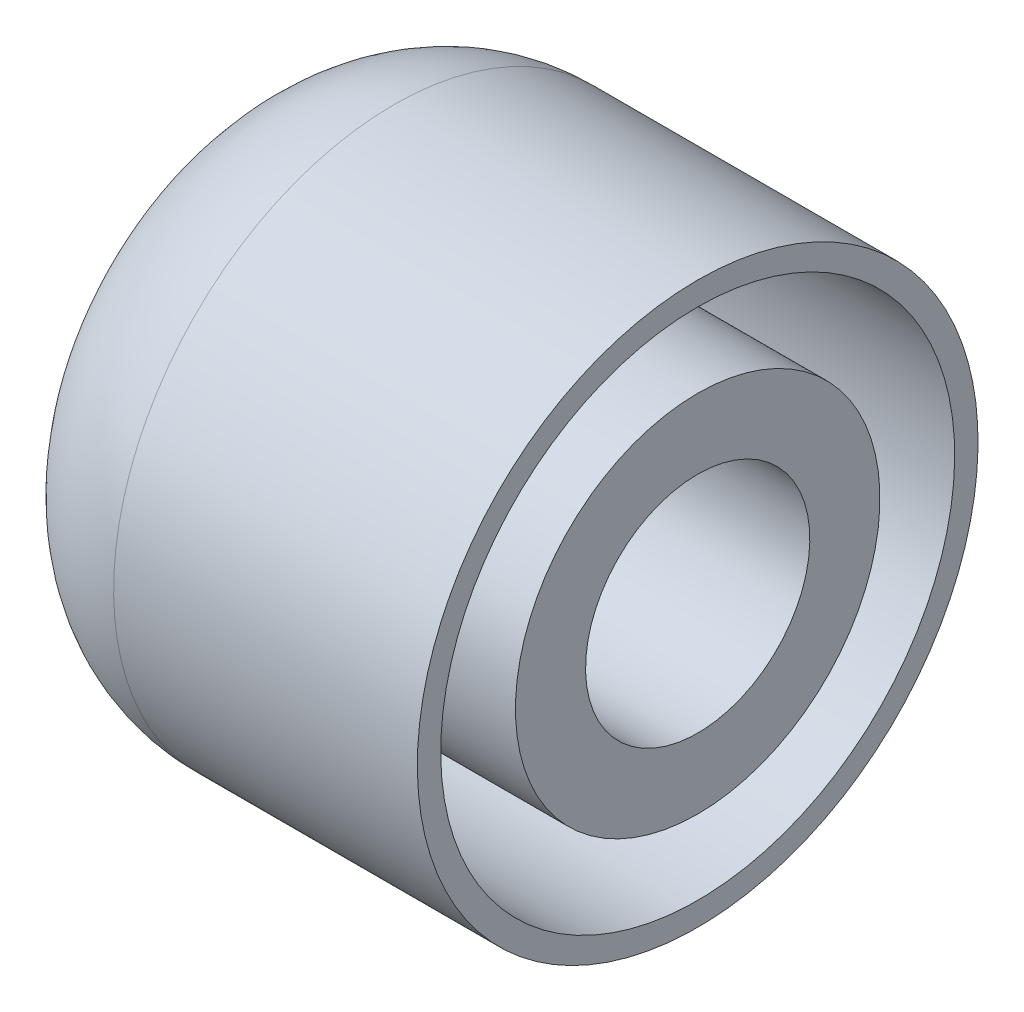
ISO-10303-21;
HEADER;
FILE_DESCRIPTION(('STEP AP214'),'2;1');
FILE_NAME('part.step','',(''),(''),'','','');
FILE_SCHEMA(('AUTOMOTIVE_DESIGN { 1 0 10303 214 1 1 1 1 }'));
ENDSEC;
DATA;
#1=APPLICATION_CONTEXT('core data for automotive mechanical design processes');
#2=APPLICATION_PROTOCOL_DEFINITION('international standard','automotive_design',2000,#1);
#3=PRODUCT_CONTEXT('',#1,'mechanical');
#4=PRODUCT('Part','Part','',(#3));
#5=PRODUCT_RELATED_PRODUCT_CATEGORY('part','',(#4));
#6=PRODUCT_DEFINITION_FORMATION('','',#4);
#7=PRODUCT_DEFINITION_CONTEXT('part definition',#1,'design');
#8=PRODUCT_DEFINITION('design','',#6,#7);
#9=PRODUCT_DEFINITION_SHAPE('','',#8);
#10=(LENGTH_UNIT() NAMED_UNIT(*) SI_UNIT(.MILLI.,.METRE.));
#11=(NAMED_UNIT(*) PLANE_ANGLE_UNIT() SI_UNIT($,.RADIAN.));
#12=(NAMED_UNIT(*) SI_UNIT($,.STERADIAN.) SOLID_ANGLE_UNIT());
#13=UNCERTAINTY_MEASURE_WITH_UNIT(LENGTH_MEASURE(1.E-05),#10,'distance_accuracy_value','');
#14=(GEOMETRIC_REPRESENTATION_CONTEXT(3) GLOBAL_UNCERTAINTY_ASSIGNED_CONTEXT((#13)) GLOBAL_UNIT_ASSIGNED_CONTEXT((#10,
#11,#12)) REPRESENTATION_CONTEXT('',''));
#15=CARTESIAN_POINT('',(0.,0.,0.));
#16=DIRECTION('',(0.,0.,1.));
#17=DIRECTION('',(1.,0.,0.));
#18=AXIS2_PLACEMENT_3D('',#15,#16,#17);
#19=CARTESIAN_POINT('',(0.,3.9,0.));
#20=DIRECTION('',(1.,0.,0.));
#21=DIRECTION('',(0.,1.,0.));
#22=AXIS2_PLACEMENT_3D('',#19,#20,#21);
#23=PLANE('',#22);
#24=CARTESIAN_POINT('',(0.,0.,0.));
#25=DIRECTION('',(1.,0.,0.));
#26=DIRECTION('',(0.,1.,0.));
#27=AXIS2_PLACEMENT_3D('',#24,#25,#26);
#28=CIRCLE('',#27,3.9);
#29=CARTESIAN_POINT('',(0.,3.9,0.));
#30=VERTEX_POINT('',#29);
#31=EDGE_CURVE('E61',#30,#30,#28,.T.);
#32=ORIENTED_EDGE('',*,*,#31,.T.);
#33=EDGE_LOOP('',(#32));
#34=FACE_BOUND('',#33,.T.);
#35=CARTESIAN_POINT('',(0.,0.,0.));
#36=DIRECTION('',(1.,0.,0.));
#37=DIRECTION('',(0.,1.,0.));
#38=AXIS2_PLACEMENT_3D('',#35,#36,#37);
#39=CIRCLE('',#38,2.4);
#40=CARTESIAN_POINT('',(0.,2.4,0.));
#41=VERTEX_POINT('',#40);
#42=EDGE_CURVE('E10',#41,#41,#39,.T.);
#43=ORIENTED_EDGE('',*,*,#42,.F.);
#44=EDGE_LOOP('',(#43));
#45=FACE_BOUND('',#44,.T.);
#46=ADVANCED_FACE('F30',(#34,#45),#23,.T.);
#47=CARTESIAN_POINT('',(0.,0.,0.));
#48=DIRECTION('',(1.,0.,0.));
#49=DIRECTION('',(0.,1.,0.));
#50=AXIS2_PLACEMENT_3D('',#47,#48,#49);
#51=CYLINDRICAL_SURFACE('',#50,2.4);
#52=ORIENTED_EDGE('',*,*,#42,.T.);
#53=EDGE_LOOP('',(#52));
#54=FACE_BOUND('',#53,.T.);
#55=CARTESIAN_POINT('',(-10.,0.,0.));
#56=DIRECTION('',(1.,0.,0.));
#57=DIRECTION('',(0.,1.,0.));
#58=AXIS2_PLACEMENT_3D('',#55,#56,#57);
#59=CIRCLE('',#58,2.4);
#60=CARTESIAN_POINT('',(-10.,2.4,0.));
#61=VERTEX_POINT('',#60);
#62=EDGE_CURVE('E36',#61,#61,#59,.T.);
#63=ORIENTED_EDGE('',*,*,#62,.F.);
#64=EDGE_LOOP('',(#63));
#65=FACE_BOUND('',#64,.T.);
#66=ADVANCED_FACE('F79',(#54,#65),#51,.F.);
#67=CARTESIAN_POINT('',(-10.,2.4,0.));
#68=DIRECTION('',(-1.,0.,0.));
#69=DIRECTION('',(0.,-1.,0.));
#70=AXIS2_PLACEMENT_3D('',#67,#68,#69);
#71=PLANE('',#70);
#72=ORIENTED_EDGE('',*,*,#62,.T.);
#73=EDGE_LOOP('',(#72));
#74=FACE_BOUND('',#73,.T.);
#75=CARTESIAN_POINT('',(-10.,0.,0.));
#76=DIRECTION('',(1.,0.,0.));
#77=DIRECTION('',(0.,1.,0.));
#78=AXIS2_PLACEMENT_3D('',#75,#76,#77);
#79=CIRCLE('',#78,2.5);
#80=CARTESIAN_POINT('',(-10.,2.5,0.));
#81=VERTEX_POINT('',#80);
#82=EDGE_CURVE('E40',#81,#81,#79,.T.);
#83=ORIENTED_EDGE('',*,*,#82,.F.);
#84=EDGE_LOOP('',(#83));
#85=FACE_BOUND('',#84,.T.);
#86=ADVANCED_FACE('F83',(#74,#85),#71,.T.);
#87=CARTESIAN_POINT('',(-6.5,0.,0.));
#88=DIRECTION('',(1.,0.,0.));
#89=DIRECTION('',(0.,1.,0.));
#90=AXIS2_PLACEMENT_3D('',#87,#88,#89);
#91=DEGENERATE_TOROIDAL_SURFACE('',#90,2.5,3.5,.T.);
#92=ORIENTED_EDGE('',*,*,#82,.T.);
#93=EDGE_LOOP('',(#92));
#94=FACE_BOUND('',#93,.T.);
#95=CARTESIAN_POINT('',(-6.5,0.,0.));
#96=DIRECTION('',(1.,0.,0.));
#97=DIRECTION('',(0.,1.,0.));
#98=AXIS2_PLACEMENT_3D('',#95,#96,#97);
#99=CIRCLE('',#98,6.);
#100=CARTESIAN_POINT('',(-6.5,6.,0.));
#101=VERTEX_POINT('',#100);
#102=EDGE_CURVE('E44',#101,#101,#99,.T.);
#103=ORIENTED_EDGE('',*,*,#102,.F.);
#104=EDGE_LOOP('',(#103));
#105=FACE_BOUND('',#104,.T.);
#106=ADVANCED_FACE('F87',(#94,#105),#91,.T.);
#107=CARTESIAN_POINT('',(0.,0.,0.));
#108=DIRECTION('',(1.,0.,0.));
#109=DIRECTION('',(0.,1.,0.));
#110=AXIS2_PLACEMENT_3D('',#107,#108,#109);
#111=CYLINDRICAL_SURFACE('',#110,6.);
#112=ORIENTED_EDGE('',*,*,#102,.T.);
#113=EDGE_LOOP('',(#112));
#114=FACE_BOUND('',#113,.T.);
#115=CARTESIAN_POINT('',(0.,0.,0.));
#116=DIRECTION('',(1.,0.,0.));
#117=DIRECTION('',(0.,1.,0.));
#118=AXIS2_PLACEMENT_3D('',#115,#116,#117);
#119=CIRCLE('',#118,6.);
#120=CARTESIAN_POINT('',(0.,6.,0.));
#121=VERTEX_POINT('',#120);
#122=EDGE_CURVE('E49',#121,#121,#119,.T.);
#123=ORIENTED_EDGE('',*,*,#122,.F.);
#124=EDGE_LOOP('',(#123));
#125=FACE_BOUND('',#124,.T.);
#126=ADVANCED_FACE('F93',(#114,#125),#111,.T.);
#127=CARTESIAN_POINT('',(0.,6.,0.));
#128=DIRECTION('',(1.,0.,0.));
#129=DIRECTION('',(0.,1.,0.));
#130=AXIS2_PLACEMENT_3D('',#127,#128,#129);
#131=PLANE('',#130);
#132=ORIENTED_EDGE('',*,*,#122,.T.);
#133=EDGE_LOOP('',(#132));
#134=FACE_BOUND('',#133,.T.);
#135=CARTESIAN_POINT('',(0.,0.,0.));
#136=DIRECTION('',(1.,0.,0.));
#137=DIRECTION('',(0.,1.,0.));
#138=AXIS2_PLACEMENT_3D('',#135,#136,#137);
#139=CIRCLE('',#138,5.5);
#140=CARTESIAN_POINT('',(0.,5.5,0.));
#141=VERTEX_POINT('',#140);
#142=EDGE_CURVE('E52',#141,#141,#139,.T.);
#143=ORIENTED_EDGE('',*,*,#142,.F.);
#144=EDGE_LOOP('',(#143));
#145=FACE_BOUND('',#144,.T.);
#146=ADVANCED_FACE('F97',(#134,#145),#131,.T.);
#147=CARTESIAN_POINT('',(0.,0.,0.));
#148=DIRECTION('',(1.,0.,0.));
#149=DIRECTION('',(0.,1.,0.));
#150=AXIS2_PLACEMENT_3D('',#147,#148,#149);
#151=CYLINDRICAL_SURFACE('',#150,5.5);
#152=ORIENTED_EDGE('',*,*,#142,.T.);
#153=EDGE_LOOP('',(#152));
#154=FACE_BOUND('',#153,.T.);
#155=CARTESIAN_POINT('',(-6.,0.,0.));
#156=DIRECTION('',(1.,0.,0.));
#157=DIRECTION('',(0.,1.,0.));
#158=AXIS2_PLACEMENT_3D('',#155,#156,#157);
#159=CIRCLE('',#158,5.5);
#160=CARTESIAN_POINT('',(-6.,5.5,0.));
#161=VERTEX_POINT('',#160);
#162=EDGE_CURVE('E55',#161,#161,#159,.T.);
#163=ORIENTED_EDGE('',*,*,#162,.F.);
#164=EDGE_LOOP('',(#163));
#165=FACE_BOUND('',#164,.T.);
#166=ADVANCED_FACE('F75',(#154,#165),#151,.F.);
#167=CARTESIAN_POINT('',(-6.,5.5,0.));
#168=DIRECTION('',(1.,0.,0.));
#169=DIRECTION('',(0.,1.,0.));
#170=AXIS2_PLACEMENT_3D('',#167,#168,#169);
#171=PLANE('',#170);
#172=ORIENTED_EDGE('',*,*,#162,.T.);
#173=EDGE_LOOP('',(#172));
#174=FACE_BOUND('',#173,.T.);
#175=CARTESIAN_POINT('',(-6.,0.,0.));
#176=DIRECTION('',(1.,0.,0.));
#177=DIRECTION('',(0.,1.,0.));
#178=AXIS2_PLACEMENT_3D('',#175,#176,#177);
#179=CIRCLE('',#178,3.9);
#180=CARTESIAN_POINT('',(-6.,3.9,0.));
#181=VERTEX_POINT('',#180);
#182=EDGE_CURVE('E58',#181,#181,#179,.T.);
#183=ORIENTED_EDGE('',*,*,#182,.F.);
#184=EDGE_LOOP('',(#183));
#185=FACE_BOUND('',#184,.T.);
#186=ADVANCED_FACE('F69',(#174,#185),#171,.T.);
#187=CARTESIAN_POINT('',(0.,0.,0.));
#188=DIRECTION('',(1.,0.,0.));
#189=DIRECTION('',(0.,1.,0.));
#190=AXIS2_PLACEMENT_3D('',#187,#188,#189);
#191=CYLINDRICAL_SURFACE('',#190,3.9);
#192=ORIENTED_EDGE('',*,*,#182,.T.);
#193=EDGE_LOOP('',(#192));
#194=FACE_BOUND('',#193,.T.);
#195=ORIENTED_EDGE('',*,*,#31,.F.);
#196=EDGE_LOOP('',(#195));
#197=FACE_BOUND('',#196,.T.);
#198=ADVANCED_FACE('F67',(#194,#197),#191,.T.);
#199=CLOSED_SHELL('',(#46,#66,#86,#106,#126,#146,#166,#186,#198));
#200=MANIFOLD_SOLID_BREP('B2',#199);
#201=ADVANCED_BREP_SHAPE_REPRESENTATION('',(#18,#200),#14);
#202=SHAPE_DEFINITION_REPRESENTATION(#9,#201);
ENDSEC;
END-ISO-10303-21;
